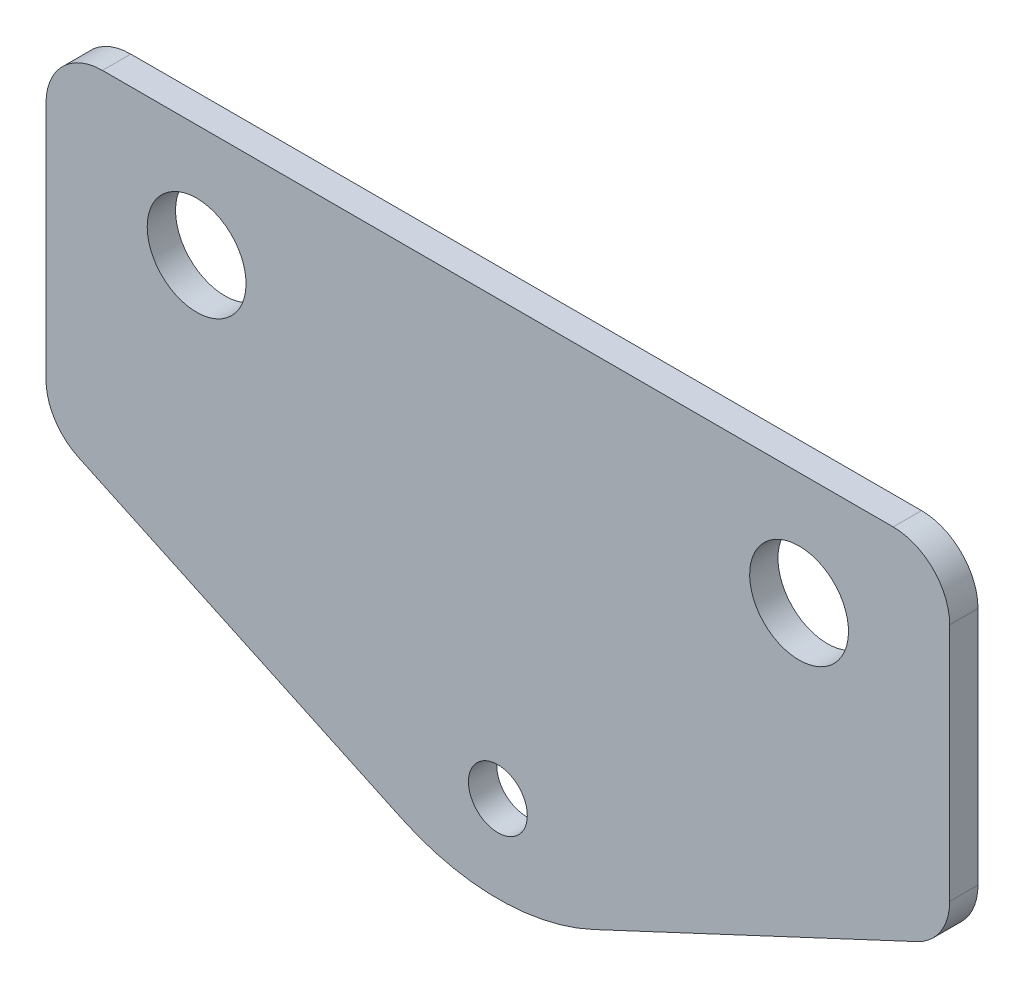
ISO-10303-21;
HEADER;
FILE_DESCRIPTION(('STEP AP214'),'2;1');
FILE_NAME('part.step','',(''),(''),'','','');
FILE_SCHEMA(('AUTOMOTIVE_DESIGN { 1 0 10303 214 1 1 1 1 }'));
ENDSEC;
DATA;
#1=APPLICATION_CONTEXT('core data for automotive mechanical design processes');
#2=APPLICATION_PROTOCOL_DEFINITION('international standard','automotive_design',2000,#1);
#3=PRODUCT_CONTEXT('',#1,'mechanical');
#4=PRODUCT('Part','Part','',(#3));
#5=PRODUCT_RELATED_PRODUCT_CATEGORY('part','',(#4));
#6=PRODUCT_DEFINITION_FORMATION('','',#4);
#7=PRODUCT_DEFINITION_CONTEXT('part definition',#1,'design');
#8=PRODUCT_DEFINITION('design','',#6,#7);
#9=PRODUCT_DEFINITION_SHAPE('','',#8);
#10=(LENGTH_UNIT() NAMED_UNIT(*) SI_UNIT(.MILLI.,.METRE.));
#11=(NAMED_UNIT(*) PLANE_ANGLE_UNIT() SI_UNIT($,.RADIAN.));
#12=(NAMED_UNIT(*) SI_UNIT($,.STERADIAN.) SOLID_ANGLE_UNIT());
#13=UNCERTAINTY_MEASURE_WITH_UNIT(LENGTH_MEASURE(1.E-05),#10,'distance_accuracy_value','');
#14=(GEOMETRIC_REPRESENTATION_CONTEXT(3) GLOBAL_UNCERTAINTY_ASSIGNED_CONTEXT((#13)) GLOBAL_UNIT_ASSIGNED_CONTEXT((#10,
#11,#12)) REPRESENTATION_CONTEXT('',''));
#15=CARTESIAN_POINT('',(0.,0.,0.));
#16=DIRECTION('',(0.,0.,1.));
#17=DIRECTION('',(1.,0.,0.));
#18=AXIS2_PLACEMENT_3D('',#15,#16,#17);
#19=CARTESIAN_POINT('',(76.2,4.42173795717241,4.7752));
#20=DIRECTION('',(0.,0.,-1.));
#21=DIRECTION('',(0.,1.,0.));
#22=AXIS2_PLACEMENT_3D('',#19,#20,#21);
#23=PLANE('',#22);
#24=CARTESIAN_POINT('',(0.,-28.575,4.7752));
#25=DIRECTION('',(0.,0.,1.));
#26=DIRECTION('',(1.,0.,0.));
#27=AXIS2_PLACEMENT_3D('',#24,#25,#26);
#28=CIRCLE('',#27,4.9657);
#29=CARTESIAN_POINT('',(4.9657,-28.575,4.7752));
#30=VERTEX_POINT('',#29);
#31=EDGE_CURVE('E291',#30,#30,#28,.T.);
#32=ORIENTED_EDGE('',*,*,#31,.F.);
#33=EDGE_LOOP('',(#32));
#34=FACE_BOUND('',#33,.T.);
#35=DIRECTION('',(0.905852953873838,0.423592287415674,0.));
#36=VECTOR('',#35,1.);
#37=CARTESIAN_POINT('',(76.2,-11.530649262825,4.7752));
#38=LINE('',#37,#36);
#39=CARTESIAN_POINT('',(16.1388661505372,-39.6162595854208,4.77519999999999));
#40=VERTEX_POINT('',#39);
#41=CARTESIAN_POINT('',(70.7097165376343,-14.0979994275934,4.77519999999999));
#42=VERTEX_POINT('',#41);
#43=EDGE_CURVE('E131',#40,#42,#38,.T.);
#44=ORIENTED_EDGE('',*,*,#43,.T.);
#45=CARTESIAN_POINT('',(66.675,-5.46975004194514,4.7752));
#46=DIRECTION('',(0.,0.,-1.));
#47=DIRECTION('',(0.,1.,0.));
#48=AXIS2_PLACEMENT_3D('',#45,#46,#47);
#49=CIRCLE('',#48,9.525);
#50=CARTESIAN_POINT('',(76.2,-5.46975004194514,4.7752));
#51=VERTEX_POINT('',#50);
#52=EDGE_CURVE('E118',#42,#51,#49,.F.);
#53=ORIENTED_EDGE('',*,*,#52,.T.);
#54=DIRECTION('',(0.,-1.,0.));
#55=VECTOR('',#54,1.);
#56=CARTESIAN_POINT('',(76.2,4.42173795717241,4.7752));
#57=LINE('',#56,#55);
#58=CARTESIAN_POINT('',(76.2,34.925,4.7752));
#59=VERTEX_POINT('',#58);
#60=EDGE_CURVE('E109',#59,#51,#57,.T.);
#61=ORIENTED_EDGE('',*,*,#60,.F.);
#62=CARTESIAN_POINT('',(66.675,34.925,4.7752));
#63=DIRECTION('',(0.,0.,-1.));
#64=DIRECTION('',(0.,1.,0.));
#65=AXIS2_PLACEMENT_3D('',#62,#63,#64);
#66=CIRCLE('',#65,9.525);
#67=CARTESIAN_POINT('',(66.675,44.45,4.7752));
#68=VERTEX_POINT('',#67);
#69=EDGE_CURVE('E115',#59,#68,#66,.F.);
#70=ORIENTED_EDGE('',*,*,#69,.T.);
#71=DIRECTION('',(-1.,0.,0.));
#72=VECTOR('',#71,1.);
#73=CARTESIAN_POINT('',(76.2,44.45,4.7752));
#74=LINE('',#73,#72);
#75=CARTESIAN_POINT('',(-66.6749999999999,44.45,4.7752));
#76=VERTEX_POINT('',#75);
#77=EDGE_CURVE('E138',#68,#76,#74,.T.);
#78=ORIENTED_EDGE('',*,*,#77,.T.);
#79=CARTESIAN_POINT('',(-66.675,34.925,4.7752));
#80=DIRECTION('',(0.,0.,-1.));
#81=DIRECTION('',(0.,1.,0.));
#82=AXIS2_PLACEMENT_3D('',#79,#80,#81);
#83=CIRCLE('',#82,9.525);
#84=CARTESIAN_POINT('',(-76.2,34.925,4.7752));
#85=VERTEX_POINT('',#84);
#86=EDGE_CURVE('E132',#76,#85,#83,.F.);
#87=ORIENTED_EDGE('',*,*,#86,.T.);
#88=DIRECTION('',(0.,-1.,0.));
#89=VECTOR('',#88,1.);
#90=CARTESIAN_POINT('',(-76.2,4.42173795717241,4.7752));
#91=LINE('',#90,#89);
#92=CARTESIAN_POINT('',(-76.2,-5.46975004194514,4.7752));
#93=VERTEX_POINT('',#92);
#94=EDGE_CURVE('E189',#85,#93,#91,.T.);
#95=ORIENTED_EDGE('',*,*,#94,.T.);
#96=CARTESIAN_POINT('',(-66.675,-5.46975004194515,4.7752));
#97=DIRECTION('',(0.,0.,-1.));
#98=DIRECTION('',(0.,1.,0.));
#99=AXIS2_PLACEMENT_3D('',#96,#97,#98);
#100=CIRCLE('',#99,9.525);
#101=CARTESIAN_POINT('',(-70.7097165376343,-14.0979994275934,4.7752));
#102=VERTEX_POINT('',#101);
#103=EDGE_CURVE('E49',#93,#102,#100,.F.);
#104=ORIENTED_EDGE('',*,*,#103,.T.);
#105=DIRECTION('',(-0.905852953873838,0.423592287415674,0.));
#106=VECTOR('',#105,1.);
#107=CARTESIAN_POINT('',(42.7336754978003,-67.1460639274477,4.77519999999998));
#108=LINE('',#107,#106);
#109=CARTESIAN_POINT('',(-16.1388661505372,-39.6162595854208,4.77519999999999));
#110=VERTEX_POINT('',#109);
#111=EDGE_CURVE('E182',#110,#102,#108,.T.);
#112=ORIENTED_EDGE('',*,*,#111,.F.);
#113=CARTESIAN_POINT('',(0.,-5.10326204282762,4.7752));
#114=DIRECTION('',(0.,0.,-1.));
#115=DIRECTION('',(0.,1.,0.));
#116=AXIS2_PLACEMENT_3D('',#113,#114,#115);
#117=CIRCLE('',#116,38.1);
#118=EDGE_CURVE('E184',#40,#110,#117,.T.);
#119=ORIENTED_EDGE('',*,*,#118,.F.);
#120=EDGE_LOOP('',(#44,#53,#61,#70,#78,#87,#95,#104,#112,#119));
#121=FACE_BOUND('',#120,.T.);
#122=CARTESIAN_POINT('',(50.8,25.4,4.7752));
#123=DIRECTION('',(0.,0.,-1.));
#124=DIRECTION('',(0.,1.,0.));
#125=AXIS2_PLACEMENT_3D('',#122,#123,#124);
#126=CIRCLE('',#125,8.334375);
#127=CARTESIAN_POINT('',(50.8,33.734375,4.7752));
#128=VERTEX_POINT('',#127);
#129=EDGE_CURVE('E156',#128,#128,#126,.F.);
#130=ORIENTED_EDGE('',*,*,#129,.F.);
#131=EDGE_LOOP('',(#130));
#132=FACE_BOUND('',#131,.T.);
#133=CARTESIAN_POINT('',(-50.8,25.4,4.7752));
#134=DIRECTION('',(0.,0.,-1.));
#135=DIRECTION('',(0.,1.,0.));
#136=AXIS2_PLACEMENT_3D('',#133,#134,#135);
#137=CIRCLE('',#136,8.334375);
#138=CARTESIAN_POINT('',(-50.8,33.734375,4.7752));
#139=VERTEX_POINT('',#138);
#140=EDGE_CURVE('E165',#139,#139,#137,.F.);
#141=ORIENTED_EDGE('',*,*,#140,.F.);
#142=EDGE_LOOP('',(#141));
#143=FACE_BOUND('',#142,.T.);
#144=ADVANCED_FACE('F34',(#34,#121,#132,#143),#23,.F.);
#145=CARTESIAN_POINT('',(76.2,44.45,0.));
#146=DIRECTION('',(0.,0.,-1.));
#147=DIRECTION('',(0.,1.,0.));
#148=AXIS2_PLACEMENT_3D('',#145,#146,#147);
#149=PLANE('',#148);
#150=CARTESIAN_POINT('',(0.,-28.575,0.));
#151=DIRECTION('',(0.,0.,1.));
#152=DIRECTION('',(1.,0.,0.));
#153=AXIS2_PLACEMENT_3D('',#150,#151,#152);
#154=CIRCLE('',#153,4.9657);
#155=CARTESIAN_POINT('',(4.9657,-28.575,0.));
#156=VERTEX_POINT('',#155);
#157=EDGE_CURVE('E168',#156,#156,#154,.T.);
#158=ORIENTED_EDGE('',*,*,#157,.T.);
#159=EDGE_LOOP('',(#158));
#160=FACE_BOUND('',#159,.T.);
#161=DIRECTION('',(0.,-1.,0.));
#162=VECTOR('',#161,1.);
#163=CARTESIAN_POINT('',(76.2,4.42173795717241,0.));
#164=LINE('',#163,#162);
#165=CARTESIAN_POINT('',(76.2,34.925,0.));
#166=VERTEX_POINT('',#165);
#167=CARTESIAN_POINT('',(76.2,-5.46975004194514,0.));
#168=VERTEX_POINT('',#167);
#169=EDGE_CURVE('E122',#166,#168,#164,.T.);
#170=ORIENTED_EDGE('',*,*,#169,.T.);
#171=CARTESIAN_POINT('',(66.675,-5.46975004194514,0.));
#172=DIRECTION('',(0.,0.,-1.));
#173=DIRECTION('',(0.,1.,0.));
#174=AXIS2_PLACEMENT_3D('',#171,#172,#173);
#175=CIRCLE('',#174,9.525);
#176=CARTESIAN_POINT('',(70.7097165376343,-14.0979994275934,0.));
#177=VERTEX_POINT('',#176);
#178=EDGE_CURVE('E198',#168,#177,#175,.T.);
#179=ORIENTED_EDGE('',*,*,#178,.T.);
#180=DIRECTION('',(0.905852953873838,0.423592287415674,0.));
#181=VECTOR('',#180,1.);
#182=CARTESIAN_POINT('',(76.2,-11.530649262825,0.));
#183=LINE('',#182,#181);
#184=CARTESIAN_POINT('',(16.1388661505372,-39.6162595854208,0.));
#185=VERTEX_POINT('',#184);
#186=EDGE_CURVE('E172',#185,#177,#183,.T.);
#187=ORIENTED_EDGE('',*,*,#186,.F.);
#188=CARTESIAN_POINT('',(0.,-5.10326204282762,0.));
#189=DIRECTION('',(0.,0.,-1.));
#190=DIRECTION('',(0.,1.,0.));
#191=AXIS2_PLACEMENT_3D('',#188,#189,#190);
#192=CIRCLE('',#191,38.1);
#193=CARTESIAN_POINT('',(-16.1388661505372,-39.6162595854208,0.));
#194=VERTEX_POINT('',#193);
#195=EDGE_CURVE('E179',#185,#194,#192,.T.);
#196=ORIENTED_EDGE('',*,*,#195,.T.);
#197=DIRECTION('',(-0.905852953873838,0.423592287415674,0.));
#198=VECTOR('',#197,1.);
#199=CARTESIAN_POINT('',(42.7336754978003,-67.1460639274477,0.));
#200=LINE('',#199,#198);
#201=CARTESIAN_POINT('',(-70.7097165376343,-14.0979994275934,0.));
#202=VERTEX_POINT('',#201);
#203=EDGE_CURVE('E175',#194,#202,#200,.T.);
#204=ORIENTED_EDGE('',*,*,#203,.T.);
#205=CARTESIAN_POINT('',(-66.675,-5.46975004194514,0.));
#206=DIRECTION('',(0.,0.,-1.));
#207=DIRECTION('',(0.,1.,0.));
#208=AXIS2_PLACEMENT_3D('',#205,#206,#207);
#209=CIRCLE('',#208,9.525);
#210=CARTESIAN_POINT('',(-76.2,-5.46975004194514,0.));
#211=VERTEX_POINT('',#210);
#212=EDGE_CURVE('E196',#202,#211,#209,.T.);
#213=ORIENTED_EDGE('',*,*,#212,.T.);
#214=DIRECTION('',(0.,-1.,0.));
#215=VECTOR('',#214,1.);
#216=CARTESIAN_POINT('',(-76.2,4.42173795717241,0.));
#217=LINE('',#216,#215);
#218=CARTESIAN_POINT('',(-76.2,34.925,0.));
#219=VERTEX_POINT('',#218);
#220=EDGE_CURVE('E123',#219,#211,#217,.T.);
#221=ORIENTED_EDGE('',*,*,#220,.F.);
#222=CARTESIAN_POINT('',(-66.675,34.925,0.));
#223=DIRECTION('',(0.,0.,-1.));
#224=DIRECTION('',(0.,1.,0.));
#225=AXIS2_PLACEMENT_3D('',#222,#223,#224);
#226=CIRCLE('',#225,9.525);
#227=CARTESIAN_POINT('',(-66.6749999999999,44.45,0.));
#228=VERTEX_POINT('',#227);
#229=EDGE_CURVE('E149',#219,#228,#226,.T.);
#230=ORIENTED_EDGE('',*,*,#229,.T.);
#231=DIRECTION('',(-1.,0.,0.));
#232=VECTOR('',#231,1.);
#233=CARTESIAN_POINT('',(76.2,44.45,0.));
#234=LINE('',#233,#232);
#235=CARTESIAN_POINT('',(66.675,44.45,0.));
#236=VERTEX_POINT('',#235);
#237=EDGE_CURVE('E161',#236,#228,#234,.T.);
#238=ORIENTED_EDGE('',*,*,#237,.F.);
#239=CARTESIAN_POINT('',(66.675,34.925,0.));
#240=DIRECTION('',(0.,0.,-1.));
#241=DIRECTION('',(0.,1.,0.));
#242=AXIS2_PLACEMENT_3D('',#239,#240,#241);
#243=CIRCLE('',#242,9.525);
#244=EDGE_CURVE('E151',#236,#166,#243,.T.);
#245=ORIENTED_EDGE('',*,*,#244,.T.);
#246=EDGE_LOOP('',(#170,#179,#187,#196,#204,#213,#221,#230,#238,#245));
#247=FACE_BOUND('',#246,.T.);
#248=CARTESIAN_POINT('',(50.8,25.4,0.));
#249=DIRECTION('',(0.,0.,1.));
#250=DIRECTION('',(1.,0.,0.));
#251=AXIS2_PLACEMENT_3D('',#248,#249,#250);
#252=CIRCLE('',#251,8.334375);
#253=CARTESIAN_POINT('',(59.134375,25.4,0.));
#254=VERTEX_POINT('',#253);
#255=EDGE_CURVE('E153',#254,#254,#252,.T.);
#256=ORIENTED_EDGE('',*,*,#255,.T.);
#257=EDGE_LOOP('',(#256));
#258=FACE_BOUND('',#257,.T.);
#259=CARTESIAN_POINT('',(-50.8,25.4,0.));
#260=DIRECTION('',(0.,0.,1.));
#261=DIRECTION('',(-1.,0.,0.));
#262=AXIS2_PLACEMENT_3D('',#259,#260,#261);
#263=CIRCLE('',#262,8.334375);
#264=CARTESIAN_POINT('',(-59.134375,25.4,0.));
#265=VERTEX_POINT('',#264);
#266=EDGE_CURVE('E143',#265,#265,#263,.T.);
#267=ORIENTED_EDGE('',*,*,#266,.T.);
#268=EDGE_LOOP('',(#267));
#269=FACE_BOUND('',#268,.T.);
#270=ADVANCED_FACE('F36',(#160,#247,#258,#269),#149,.T.);
#271=CARTESIAN_POINT('',(76.2,1.16935073717493,5.02589032539292));
#272=DIRECTION('',(1.,0.,0.));
#273=DIRECTION('',(0.,0.93969262078591,-0.342020143325666));
#274=AXIS2_PLACEMENT_3D('',#271,#272,#273);
#275=PLANE('',#274);
#276=ORIENTED_EDGE('',*,*,#60,.T.);
#277=DIRECTION('',(0.,0.,1.));
#278=VECTOR('',#277,1.);
#279=CARTESIAN_POINT('',(76.2,-5.46975004194514,5.02589032539292));
#280=LINE('',#279,#278);
#281=EDGE_CURVE('E194',#51,#168,#280,.F.);
#282=ORIENTED_EDGE('',*,*,#281,.T.);
#283=ORIENTED_EDGE('',*,*,#169,.F.);
#284=DIRECTION('',(0.,0.,-1.));
#285=VECTOR('',#284,1.);
#286=CARTESIAN_POINT('',(76.2,34.925,5.1562));
#287=LINE('',#286,#285);
#288=EDGE_CURVE('E126',#166,#59,#287,.F.);
#289=ORIENTED_EDGE('',*,*,#288,.T.);
#290=EDGE_LOOP('',(#276,#282,#283,#289));
#291=FACE_BOUND('',#290,.T.);
#292=ADVANCED_FACE('F127',(#291),#275,.T.);
#293=CARTESIAN_POINT('',(-76.2,0.811327848655495,5.1562));
#294=DIRECTION('',(1.,0.,0.));
#295=DIRECTION('',(0.,0.93969262078591,-0.342020143325666));
#296=AXIS2_PLACEMENT_3D('',#293,#294,#295);
#297=PLANE('',#296);
#298=ORIENTED_EDGE('',*,*,#220,.T.);
#299=DIRECTION('',(0.,0.,1.));
#300=VECTOR('',#299,1.);
#301=CARTESIAN_POINT('',(-76.2,-5.46975004194514,4.7752));
#302=LINE('',#301,#300);
#303=EDGE_CURVE('E42',#211,#93,#302,.T.);
#304=ORIENTED_EDGE('',*,*,#303,.T.);
#305=ORIENTED_EDGE('',*,*,#94,.F.);
#306=DIRECTION('',(0.,0.,-1.));
#307=VECTOR('',#306,1.);
#308=CARTESIAN_POINT('',(-76.2,34.925,5.02589032539292));
#309=LINE('',#308,#307);
#310=EDGE_CURVE('E139',#85,#219,#309,.T.);
#311=ORIENTED_EDGE('',*,*,#310,.T.);
#312=EDGE_LOOP('',(#298,#304,#305,#311));
#313=FACE_BOUND('',#312,.T.);
#314=ADVANCED_FACE('F204',(#313),#297,.F.);
#315=CARTESIAN_POINT('',(42.7336754978003,-67.1460639274477,0.));
#316=DIRECTION('',(-0.423592287415674,-0.905852953873838,0.));
#317=DIRECTION('',(-0.905852953873838,0.423592287415674,0.));
#318=AXIS2_PLACEMENT_3D('',#315,#316,#317);
#319=PLANE('',#318);
#320=ORIENTED_EDGE('',*,*,#111,.T.);
#321=DIRECTION('',(0.,0.,1.));
#322=VECTOR('',#321,1.);
#323=CARTESIAN_POINT('',(-70.7097165376343,-14.0979994275935,0.));
#324=LINE('',#323,#322);
#325=EDGE_CURVE('E12',#102,#202,#324,.F.);
#326=ORIENTED_EDGE('',*,*,#325,.T.);
#327=ORIENTED_EDGE('',*,*,#203,.F.);
#328=DIRECTION('',(0.,0.,-1.));
#329=VECTOR('',#328,1.);
#330=CARTESIAN_POINT('',(-16.1388661505372,-39.6162595854208,0.));
#331=LINE('',#330,#329);
#332=EDGE_CURVE('E186',#194,#110,#331,.F.);
#333=ORIENTED_EDGE('',*,*,#332,.T.);
#334=EDGE_LOOP('',(#320,#326,#327,#333));
#335=FACE_BOUND('',#334,.T.);
#336=ADVANCED_FACE('F243',(#335),#319,.T.);
#337=CARTESIAN_POINT('',(0.,-5.10326204282762,0.));
#338=DIRECTION('',(0.,0.,-1.));
#339=DIRECTION('',(0.,1.,0.));
#340=AXIS2_PLACEMENT_3D('',#337,#338,#339);
#341=CYLINDRICAL_SURFACE('',#340,38.1);
#342=ORIENTED_EDGE('',*,*,#195,.F.);
#343=DIRECTION('',(0.,0.,1.));
#344=VECTOR('',#343,1.);
#345=CARTESIAN_POINT('',(16.1388661505372,-39.6162595854208,4.77519999999999));
#346=LINE('',#345,#344);
#347=EDGE_CURVE('E169',#40,#185,#346,.F.);
#348=ORIENTED_EDGE('',*,*,#347,.F.);
#349=ORIENTED_EDGE('',*,*,#118,.T.);
#350=ORIENTED_EDGE('',*,*,#332,.F.);
#351=EDGE_LOOP('',(#342,#348,#349,#350));
#352=FACE_BOUND('',#351,.T.);
#353=ADVANCED_FACE('F247',(#352),#341,.T.);
#354=CARTESIAN_POINT('',(76.2,-11.530649262825,4.7752));
#355=DIRECTION('',(-0.423592287415674,0.905852953873838,0.));
#356=DIRECTION('',(0.905852953873838,0.423592287415674,0.));
#357=AXIS2_PLACEMENT_3D('',#354,#355,#356);
#358=PLANE('',#357);
#359=ORIENTED_EDGE('',*,*,#186,.T.);
#360=DIRECTION('',(0.,0.,-1.));
#361=VECTOR('',#360,1.);
#362=CARTESIAN_POINT('',(70.7097165376343,-14.0979994275934,4.7752));
#363=LINE('',#362,#361);
#364=EDGE_CURVE('E200',#177,#42,#363,.F.);
#365=ORIENTED_EDGE('',*,*,#364,.T.);
#366=ORIENTED_EDGE('',*,*,#43,.F.);
#367=ORIENTED_EDGE('',*,*,#347,.T.);
#368=EDGE_LOOP('',(#359,#365,#366,#367));
#369=FACE_BOUND('',#368,.T.);
#370=ADVANCED_FACE('F253',(#369),#358,.F.);
#371=CARTESIAN_POINT('',(66.675,-5.46975004194514,5.02589032539292));
#372=DIRECTION('',(0.,0.,1.));
#373=DIRECTION('',(0.,-1.,0.));
#374=AXIS2_PLACEMENT_3D('',#371,#372,#373);
#375=CYLINDRICAL_SURFACE('',#374,9.525);
#376=ORIENTED_EDGE('',*,*,#52,.F.);
#377=ORIENTED_EDGE('',*,*,#364,.F.);
#378=ORIENTED_EDGE('',*,*,#178,.F.);
#379=ORIENTED_EDGE('',*,*,#281,.F.);
#380=EDGE_LOOP('',(#376,#377,#378,#379));
#381=FACE_BOUND('',#380,.T.);
#382=ADVANCED_FACE('F258',(#381),#375,.T.);
#383=CARTESIAN_POINT('',(-66.675,-5.46975004194515,5.1562));
#384=DIRECTION('',(0.,0.,-1.));
#385=DIRECTION('',(0.,1.,0.));
#386=AXIS2_PLACEMENT_3D('',#383,#384,#385);
#387=CYLINDRICAL_SURFACE('',#386,9.525);
#388=ORIENTED_EDGE('',*,*,#212,.F.);
#389=ORIENTED_EDGE('',*,*,#325,.F.);
#390=ORIENTED_EDGE('',*,*,#103,.F.);
#391=ORIENTED_EDGE('',*,*,#303,.F.);
#392=EDGE_LOOP('',(#388,#389,#390,#391));
#393=FACE_BOUND('',#392,.T.);
#394=ADVANCED_FACE('F262',(#393),#387,.T.);
#395=CARTESIAN_POINT('',(-50.8,25.4,46.3860756533377));
#396=DIRECTION('',(0.,0.,-1.));
#397=DIRECTION('',(-1.,0.,0.));
#398=AXIS2_PLACEMENT_3D('',#395,#396,#397);
#399=CYLINDRICAL_SURFACE('',#398,8.334375);
#400=ORIENTED_EDGE('',*,*,#266,.F.);
#401=EDGE_LOOP('',(#400));
#402=FACE_BOUND('',#401,.T.);
#403=ORIENTED_EDGE('',*,*,#140,.T.);
#404=EDGE_LOOP('',(#403));
#405=FACE_BOUND('',#404,.T.);
#406=ADVANCED_FACE('F265',(#402,#405),#399,.F.);
#407=CARTESIAN_POINT('',(-66.675,34.925,5.02589032539292));
#408=DIRECTION('',(0.,0.,-1.));
#409=DIRECTION('',(-1.,0.,0.));
#410=AXIS2_PLACEMENT_3D('',#407,#408,#409);
#411=CYLINDRICAL_SURFACE('',#410,9.525);
#412=ORIENTED_EDGE('',*,*,#86,.F.);
#413=DIRECTION('',(0.,0.,-1.));
#414=VECTOR('',#413,1.);
#415=CARTESIAN_POINT('',(-66.675,44.45,4.7752));
#416=LINE('',#415,#414);
#417=EDGE_CURVE('E159',#228,#76,#416,.F.);
#418=ORIENTED_EDGE('',*,*,#417,.F.);
#419=ORIENTED_EDGE('',*,*,#229,.F.);
#420=ORIENTED_EDGE('',*,*,#310,.F.);
#421=EDGE_LOOP('',(#412,#418,#419,#420));
#422=FACE_BOUND('',#421,.T.);
#423=ADVANCED_FACE('F212',(#422),#411,.T.);
#424=CARTESIAN_POINT('',(66.675,34.925,4.7752));
#425=DIRECTION('',(0.,0.,-1.));
#426=DIRECTION('',(-1.,0.,0.));
#427=AXIS2_PLACEMENT_3D('',#424,#425,#426);
#428=CYLINDRICAL_SURFACE('',#427,9.525);
#429=ORIENTED_EDGE('',*,*,#69,.F.);
#430=ORIENTED_EDGE('',*,*,#288,.F.);
#431=ORIENTED_EDGE('',*,*,#244,.F.);
#432=DIRECTION('',(0.,0.,-1.));
#433=VECTOR('',#432,1.);
#434=CARTESIAN_POINT('',(66.675,44.45,4.7752));
#435=LINE('',#434,#433);
#436=EDGE_CURVE('E137',#68,#236,#435,.T.);
#437=ORIENTED_EDGE('',*,*,#436,.F.);
#438=EDGE_LOOP('',(#429,#430,#431,#437));
#439=FACE_BOUND('',#438,.T.);
#440=ADVANCED_FACE('F135',(#439),#428,.T.);
#441=CARTESIAN_POINT('',(76.2,44.45,4.7752));
#442=DIRECTION('',(0.,1.,0.));
#443=DIRECTION('',(0.,0.,1.));
#444=AXIS2_PLACEMENT_3D('',#441,#442,#443);
#445=PLANE('',#444);
#446=ORIENTED_EDGE('',*,*,#77,.F.);
#447=ORIENTED_EDGE('',*,*,#436,.T.);
#448=ORIENTED_EDGE('',*,*,#237,.T.);
#449=ORIENTED_EDGE('',*,*,#417,.T.);
#450=EDGE_LOOP('',(#446,#447,#448,#449));
#451=FACE_BOUND('',#450,.T.);
#452=ADVANCED_FACE('F217',(#451),#445,.T.);
#453=CARTESIAN_POINT('',(50.8,25.4,46.3860756533377));
#454=DIRECTION('',(0.,0.,-1.));
#455=DIRECTION('',(-1.,0.,0.));
#456=AXIS2_PLACEMENT_3D('',#453,#454,#455);
#457=CYLINDRICAL_SURFACE('',#456,8.334375);
#458=ORIENTED_EDGE('',*,*,#255,.F.);
#459=EDGE_LOOP('',(#458));
#460=FACE_BOUND('',#459,.T.);
#461=ORIENTED_EDGE('',*,*,#129,.T.);
#462=EDGE_LOOP('',(#461));
#463=FACE_BOUND('',#462,.T.);
#464=ADVANCED_FACE('F219',(#460,#463),#457,.F.);
#465=CARTESIAN_POINT('',(0.,-28.575,0.));
#466=DIRECTION('',(0.,0.,1.));
#467=DIRECTION('',(1.,0.,0.));
#468=AXIS2_PLACEMENT_3D('',#465,#466,#467);
#469=CYLINDRICAL_SURFACE('',#468,4.9657);
#470=ORIENTED_EDGE('',*,*,#157,.F.);
#471=EDGE_LOOP('',(#470));
#472=FACE_BOUND('',#471,.T.);
#473=ORIENTED_EDGE('',*,*,#31,.T.);
#474=EDGE_LOOP('',(#473));
#475=FACE_BOUND('',#474,.T.);
#476=ADVANCED_FACE('F225',(#472,#475),#469,.F.);
#477=CLOSED_SHELL('',(#144,#270,#292,#314,#336,#353,#370,#382,#394,#406,#423,#440,#452,#464,#476));
#478=MANIFOLD_SOLID_BREP('B2',#477);
#479=ADVANCED_BREP_SHAPE_REPRESENTATION('',(#18,#478),#14);
#480=SHAPE_DEFINITION_REPRESENTATION(#9,#479);
ENDSEC;
END-ISO-10303-21;
